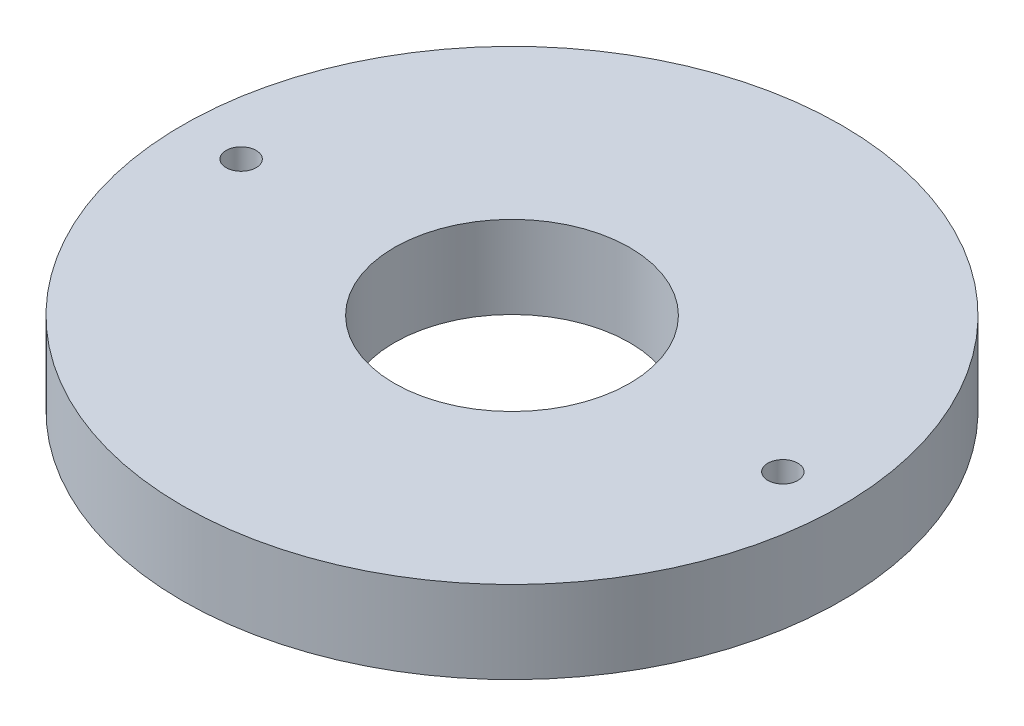
ISO-10303-21;
HEADER;
FILE_DESCRIPTION(('STEP AP214'),'2;1');
FILE_NAME('part.step','',(''),(''),'','','');
FILE_SCHEMA(('AUTOMOTIVE_DESIGN { 1 0 10303 214 1 1 1 1 }'));
ENDSEC;
DATA;
#1=APPLICATION_CONTEXT('core data for automotive mechanical design processes');
#2=APPLICATION_PROTOCOL_DEFINITION('international standard','automotive_design',2000,#1);
#3=PRODUCT_CONTEXT('',#1,'mechanical');
#4=PRODUCT('Part','Part','',(#3));
#5=PRODUCT_RELATED_PRODUCT_CATEGORY('part','',(#4));
#6=PRODUCT_DEFINITION_FORMATION('','',#4);
#7=PRODUCT_DEFINITION_CONTEXT('part definition',#1,'design');
#8=PRODUCT_DEFINITION('design','',#6,#7);
#9=PRODUCT_DEFINITION_SHAPE('','',#8);
#10=(LENGTH_UNIT() NAMED_UNIT(*) SI_UNIT(.MILLI.,.METRE.));
#11=(NAMED_UNIT(*) PLANE_ANGLE_UNIT() SI_UNIT($,.RADIAN.));
#12=(NAMED_UNIT(*) SI_UNIT($,.STERADIAN.) SOLID_ANGLE_UNIT());
#13=UNCERTAINTY_MEASURE_WITH_UNIT(LENGTH_MEASURE(1.E-05),#10,'distance_accuracy_value','');
#14=(GEOMETRIC_REPRESENTATION_CONTEXT(3) GLOBAL_UNCERTAINTY_ASSIGNED_CONTEXT((#13)) GLOBAL_UNIT_ASSIGNED_CONTEXT((#10,
#11,#12)) REPRESENTATION_CONTEXT('',''));
#15=CARTESIAN_POINT('',(0.,0.,0.));
#16=DIRECTION('',(0.,0.,1.));
#17=DIRECTION('',(1.,0.,0.));
#18=AXIS2_PLACEMENT_3D('',#15,#16,#17);
#19=CARTESIAN_POINT('',(0.,7.,0.));
#20=DIRECTION('',(0.,-1.,0.));
#21=DIRECTION('',(0.,0.,-1.));
#22=AXIS2_PLACEMENT_3D('',#19,#20,#21);
#23=CYLINDRICAL_SURFACE('',#22,28.);
#24=CARTESIAN_POINT('',(0.,7.,0.));
#25=DIRECTION('',(0.,1.,0.));
#26=DIRECTION('',(0.,0.,1.));
#27=AXIS2_PLACEMENT_3D('',#24,#25,#26);
#28=CIRCLE('',#27,28.);
#29=CARTESIAN_POINT('',(0.,7.,28.));
#30=VERTEX_POINT('',#29);
#31=EDGE_CURVE('E10',#30,#30,#28,.T.);
#32=ORIENTED_EDGE('',*,*,#31,.F.);
#33=EDGE_LOOP('',(#32));
#34=FACE_BOUND('',#33,.T.);
#35=CARTESIAN_POINT('',(0.,0.,0.));
#36=DIRECTION('',(0.,1.,0.));
#37=DIRECTION('',(0.,0.,1.));
#38=AXIS2_PLACEMENT_3D('',#35,#36,#37);
#39=CIRCLE('',#38,28.);
#40=CARTESIAN_POINT('',(0.,0.,28.));
#41=VERTEX_POINT('',#40);
#42=EDGE_CURVE('E36',#41,#41,#39,.T.);
#43=ORIENTED_EDGE('',*,*,#42,.T.);
#44=EDGE_LOOP('',(#43));
#45=FACE_BOUND('',#44,.T.);
#46=ADVANCED_FACE('F33',(#34,#45),#23,.T.);
#47=CARTESIAN_POINT('',(0.,7.,0.));
#48=DIRECTION('',(0.,1.,0.));
#49=DIRECTION('',(0.,0.,1.));
#50=AXIS2_PLACEMENT_3D('',#47,#48,#49);
#51=PLANE('',#50);
#52=CARTESIAN_POINT('',(-23.0124,7.,0.));
#53=DIRECTION('',(0.,1.,0.));
#54=DIRECTION('',(0.,0.,-1.));
#55=AXIS2_PLACEMENT_3D('',#52,#53,#54);
#56=CIRCLE('',#55,1.275);
#57=CARTESIAN_POINT('',(-23.0124,7.,-1.275));
#58=VERTEX_POINT('',#57);
#59=EDGE_CURVE('E54',#58,#58,#56,.T.);
#60=ORIENTED_EDGE('',*,*,#59,.F.);
#61=EDGE_LOOP('',(#60));
#62=FACE_BOUND('',#61,.T.);
#63=CARTESIAN_POINT('',(23.0124,7.,0.));
#64=DIRECTION('',(0.,1.,0.));
#65=DIRECTION('',(0.,0.,1.));
#66=AXIS2_PLACEMENT_3D('',#63,#64,#65);
#67=CIRCLE('',#66,1.275);
#68=CARTESIAN_POINT('',(23.0124,7.,1.275));
#69=VERTEX_POINT('',#68);
#70=EDGE_CURVE('E48',#69,#69,#67,.T.);
#71=ORIENTED_EDGE('',*,*,#70,.F.);
#72=EDGE_LOOP('',(#71));
#73=FACE_BOUND('',#72,.T.);
#74=CARTESIAN_POINT('',(0.,7.,0.));
#75=DIRECTION('',(0.,1.,0.));
#76=DIRECTION('',(0.,0.,1.));
#77=AXIS2_PLACEMENT_3D('',#74,#75,#76);
#78=CIRCLE('',#77,10.);
#79=CARTESIAN_POINT('',(0.,7.,10.));
#80=VERTEX_POINT('',#79);
#81=EDGE_CURVE('E43',#80,#80,#78,.T.);
#82=ORIENTED_EDGE('',*,*,#81,.F.);
#83=EDGE_LOOP('',(#82));
#84=FACE_BOUND('',#83,.T.);
#85=ORIENTED_EDGE('',*,*,#31,.T.);
#86=EDGE_LOOP('',(#85));
#87=FACE_BOUND('',#86,.T.);
#88=ADVANCED_FACE('F66',(#62,#73,#84,#87),#51,.T.);
#89=CARTESIAN_POINT('',(0.,0.,0.));
#90=DIRECTION('',(0.,1.,0.));
#91=DIRECTION('',(0.,0.,1.));
#92=AXIS2_PLACEMENT_3D('',#89,#90,#91);
#93=PLANE('',#92);
#94=CARTESIAN_POINT('',(-23.0124,0.,0.));
#95=DIRECTION('',(0.,1.,0.));
#96=DIRECTION('',(0.,0.,-1.));
#97=AXIS2_PLACEMENT_3D('',#94,#95,#96);
#98=CIRCLE('',#97,1.275);
#99=CARTESIAN_POINT('',(-23.0124,0.,-1.275));
#100=VERTEX_POINT('',#99);
#101=EDGE_CURVE('E57',#100,#100,#98,.T.);
#102=ORIENTED_EDGE('',*,*,#101,.T.);
#103=EDGE_LOOP('',(#102));
#104=FACE_BOUND('',#103,.T.);
#105=CARTESIAN_POINT('',(23.0124,0.,0.));
#106=DIRECTION('',(0.,1.,0.));
#107=DIRECTION('',(0.,0.,1.));
#108=AXIS2_PLACEMENT_3D('',#105,#106,#107);
#109=CIRCLE('',#108,1.275);
#110=CARTESIAN_POINT('',(23.0124,0.,1.275));
#111=VERTEX_POINT('',#110);
#112=EDGE_CURVE('E51',#111,#111,#109,.T.);
#113=ORIENTED_EDGE('',*,*,#112,.T.);
#114=EDGE_LOOP('',(#113));
#115=FACE_BOUND('',#114,.T.);
#116=CARTESIAN_POINT('',(0.,0.,0.));
#117=DIRECTION('',(0.,1.,0.));
#118=DIRECTION('',(0.,0.,1.));
#119=AXIS2_PLACEMENT_3D('',#116,#117,#118);
#120=CIRCLE('',#119,10.);
#121=CARTESIAN_POINT('',(0.,0.,10.));
#122=VERTEX_POINT('',#121);
#123=EDGE_CURVE('E45',#122,#122,#120,.T.);
#124=ORIENTED_EDGE('',*,*,#123,.T.);
#125=EDGE_LOOP('',(#124));
#126=FACE_BOUND('',#125,.T.);
#127=ORIENTED_EDGE('',*,*,#42,.F.);
#128=EDGE_LOOP('',(#127));
#129=FACE_BOUND('',#128,.T.);
#130=ADVANCED_FACE('F69',(#104,#115,#126,#129),#93,.F.);
#131=CARTESIAN_POINT('',(0.,7.,0.));
#132=DIRECTION('',(0.,-1.,0.));
#133=DIRECTION('',(0.,0.,-1.));
#134=AXIS2_PLACEMENT_3D('',#131,#132,#133);
#135=CYLINDRICAL_SURFACE('',#134,10.);
#136=ORIENTED_EDGE('',*,*,#81,.T.);
#137=EDGE_LOOP('',(#136));
#138=FACE_BOUND('',#137,.T.);
#139=ORIENTED_EDGE('',*,*,#123,.F.);
#140=EDGE_LOOP('',(#139));
#141=FACE_BOUND('',#140,.T.);
#142=ADVANCED_FACE('F75',(#138,#141),#135,.F.);
#143=CARTESIAN_POINT('',(23.0124,7.,0.));
#144=DIRECTION('',(0.,-1.,0.));
#145=DIRECTION('',(0.,0.,-1.));
#146=AXIS2_PLACEMENT_3D('',#143,#144,#145);
#147=CYLINDRICAL_SURFACE('',#146,1.275);
#148=ORIENTED_EDGE('',*,*,#70,.T.);
#149=EDGE_LOOP('',(#148));
#150=FACE_BOUND('',#149,.T.);
#151=ORIENTED_EDGE('',*,*,#112,.F.);
#152=EDGE_LOOP('',(#151));
#153=FACE_BOUND('',#152,.T.);
#154=ADVANCED_FACE('F78',(#150,#153),#147,.F.);
#155=CARTESIAN_POINT('',(-23.0124,7.,0.));
#156=DIRECTION('',(0.,-1.,0.));
#157=DIRECTION('',(0.,0.,-1.));
#158=AXIS2_PLACEMENT_3D('',#155,#156,#157);
#159=CYLINDRICAL_SURFACE('',#158,1.275);
#160=ORIENTED_EDGE('',*,*,#59,.T.);
#161=EDGE_LOOP('',(#160));
#162=FACE_BOUND('',#161,.T.);
#163=ORIENTED_EDGE('',*,*,#101,.F.);
#164=EDGE_LOOP('',(#163));
#165=FACE_BOUND('',#164,.T.);
#166=ADVANCED_FACE('F63',(#162,#165),#159,.F.);
#167=CLOSED_SHELL('',(#46,#88,#130,#142,#154,#166));
#168=MANIFOLD_SOLID_BREP('B2',#167);
#169=ADVANCED_BREP_SHAPE_REPRESENTATION('',(#18,#168),#14);
#170=SHAPE_DEFINITION_REPRESENTATION(#9,#169);
ENDSEC;
END-ISO-10303-21;
